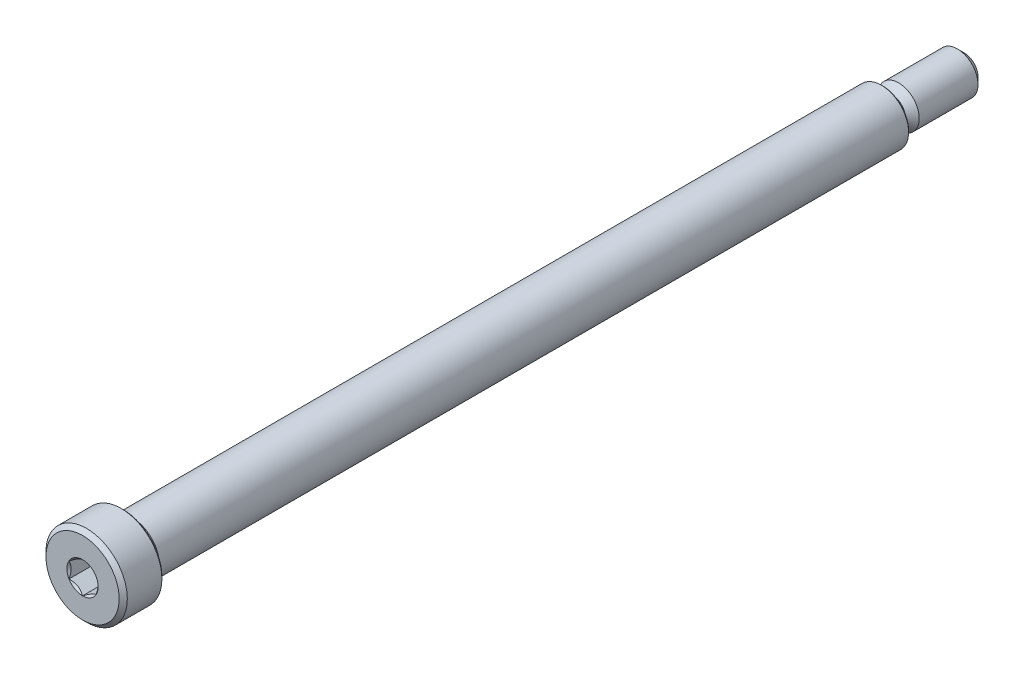
ISO-10303-21;
HEADER;
FILE_DESCRIPTION(('STEP AP214'),'2;1');
FILE_NAME('part.step','',(''),(''),'','','');
FILE_SCHEMA(('AUTOMOTIVE_DESIGN { 1 0 10303 214 1 1 1 1 }'));
ENDSEC;
DATA;
#1=APPLICATION_CONTEXT('core data for automotive mechanical design processes');
#2=APPLICATION_PROTOCOL_DEFINITION('international standard','automotive_design',2000,#1);
#3=PRODUCT_CONTEXT('',#1,'mechanical');
#4=PRODUCT('Part','Part','',(#3));
#5=PRODUCT_RELATED_PRODUCT_CATEGORY('part','',(#4));
#6=PRODUCT_DEFINITION_FORMATION('','',#4);
#7=PRODUCT_DEFINITION_CONTEXT('part definition',#1,'design');
#8=PRODUCT_DEFINITION('design','',#6,#7);
#9=PRODUCT_DEFINITION_SHAPE('','',#8);
#10=(LENGTH_UNIT() NAMED_UNIT(*) SI_UNIT(.MILLI.,.METRE.));
#11=(NAMED_UNIT(*) PLANE_ANGLE_UNIT() SI_UNIT($,.RADIAN.));
#12=(NAMED_UNIT(*) SI_UNIT($,.STERADIAN.) SOLID_ANGLE_UNIT());
#13=UNCERTAINTY_MEASURE_WITH_UNIT(LENGTH_MEASURE(1.E-05),#10,'distance_accuracy_value','');
#14=(GEOMETRIC_REPRESENTATION_CONTEXT(3) GLOBAL_UNCERTAINTY_ASSIGNED_CONTEXT((#13)) GLOBAL_UNIT_ASSIGNED_CONTEXT((#10,
#11,#12)) REPRESENTATION_CONTEXT('',''));
#15=CARTESIAN_POINT('',(0.,0.,0.));
#16=DIRECTION('',(0.,0.,1.));
#17=DIRECTION('',(1.,0.,0.));
#18=AXIS2_PLACEMENT_3D('',#15,#16,#17);
#19=CARTESIAN_POINT('',(0.,1.61924999999999,-51.59375));
#20=DIRECTION('',(0.,0.,1.));
#21=DIRECTION('',(1.,0.,0.));
#22=AXIS2_PLACEMENT_3D('',#19,#20,#21);
#23=PLANE('',#22);
#24=CARTESIAN_POINT('',(0.,0.,-51.59375));
#25=DIRECTION('',(0.,0.,1.));
#26=DIRECTION('',(1.,0.,0.));
#27=AXIS2_PLACEMENT_3D('',#24,#25,#26);
#28=CIRCLE('',#27,1.61924999999998);
#29=CARTESIAN_POINT('',(1.61924999999998,0.,-51.59375));
#30=VERTEX_POINT('',#29);
#31=EDGE_CURVE('E57',#30,#30,#28,.T.);
#32=ORIENTED_EDGE('',*,*,#31,.F.);
#33=EDGE_LOOP('',(#32));
#34=FACE_BOUND('',#33,.T.);
#35=ADVANCED_FACE('F43',(#34),#23,.F.);
#36=CARTESIAN_POINT('',(0.,0.,-51.59375));
#37=DIRECTION('',(0.,0.,1.));
#38=DIRECTION('',(1.,0.,0.));
#39=AXIS2_PLACEMENT_3D('',#36,#37,#38);
#40=CONICAL_SURFACE('',#39,1.61924999999998,0.785398163397446);
#41=CARTESIAN_POINT('',(0.,0.,-50.8));
#42=DIRECTION('',(0.,0.,1.));
#43=DIRECTION('',(1.,0.,0.));
#44=AXIS2_PLACEMENT_3D('',#41,#42,#43);
#45=CIRCLE('',#44,2.41299999999999);
#46=CARTESIAN_POINT('',(2.41299999999999,0.,-50.8));
#47=VERTEX_POINT('',#46);
#48=EDGE_CURVE('E225',#47,#47,#45,.T.);
#49=ORIENTED_EDGE('',*,*,#48,.F.);
#50=EDGE_LOOP('',(#49));
#51=FACE_BOUND('',#50,.T.);
#52=ORIENTED_EDGE('',*,*,#31,.T.);
#53=EDGE_LOOP('',(#52));
#54=FACE_BOUND('',#53,.T.);
#55=ADVANCED_FACE('F214',(#51,#54),#40,.T.);
#56=CARTESIAN_POINT('',(0.,0.,51.59375));
#57=DIRECTION('',(0.,0.,1.));
#58=DIRECTION('',(1.,0.,0.));
#59=AXIS2_PLACEMENT_3D('',#56,#57,#58);
#60=CYLINDRICAL_SURFACE('',#59,2.41299999999999);
#61=CARTESIAN_POINT('',(0.,0.,-43.9208333333333));
#62=DIRECTION('',(0.,0.,1.));
#63=DIRECTION('',(1.,0.,0.));
#64=AXIS2_PLACEMENT_3D('',#61,#62,#63);
#65=CIRCLE('',#64,2.41299999999999);
#66=CARTESIAN_POINT('',(2.41299999999999,0.,-43.9208333333333));
#67=VERTEX_POINT('',#66);
#68=EDGE_CURVE('E228',#67,#67,#65,.T.);
#69=ORIENTED_EDGE('',*,*,#68,.F.);
#70=EDGE_LOOP('',(#69));
#71=FACE_BOUND('',#70,.T.);
#72=ORIENTED_EDGE('',*,*,#48,.T.);
#73=EDGE_LOOP('',(#72));
#74=FACE_BOUND('',#73,.T.);
#75=ADVANCED_FACE('F219',(#71,#74),#60,.T.);
#76=CARTESIAN_POINT('',(0.,0.,-43.9208333333333));
#77=DIRECTION('',(0.,0.,-1.));
#78=DIRECTION('',(-1.,0.,0.));
#79=AXIS2_PLACEMENT_3D('',#76,#77,#78);
#80=CONICAL_SURFACE('',#79,2.41299999999999,0.785398163397448);
#81=CARTESIAN_POINT('',(0.,0.,-43.1270833333333));
#82=DIRECTION('',(0.,0.,1.));
#83=DIRECTION('',(1.,0.,0.));
#84=AXIS2_PLACEMENT_3D('',#81,#82,#83);
#85=CIRCLE('',#84,1.61924999999998);
#86=CARTESIAN_POINT('',(1.61924999999998,0.,-43.1270833333333));
#87=VERTEX_POINT('',#86);
#88=EDGE_CURVE('E234',#87,#87,#85,.T.);
#89=ORIENTED_EDGE('',*,*,#88,.F.);
#90=EDGE_LOOP('',(#89));
#91=FACE_BOUND('',#90,.T.);
#92=ORIENTED_EDGE('',*,*,#68,.T.);
#93=EDGE_LOOP('',(#92));
#94=FACE_BOUND('',#93,.T.);
#95=ADVANCED_FACE('F392',(#91,#94),#80,.T.);
#96=CARTESIAN_POINT('',(0.,0.,51.59375));
#97=DIRECTION('',(0.,0.,1.));
#98=DIRECTION('',(1.,0.,0.));
#99=AXIS2_PLACEMENT_3D('',#96,#97,#98);
#100=CYLINDRICAL_SURFACE('',#99,1.61924999999998);
#101=CARTESIAN_POINT('',(0.,0.,-42.465625));
#102=DIRECTION('',(0.,0.,1.));
#103=DIRECTION('',(1.,0.,0.));
#104=AXIS2_PLACEMENT_3D('',#101,#102,#103);
#105=CIRCLE('',#104,1.61924999999998);
#106=CARTESIAN_POINT('',(1.61924999999998,0.,-42.465625));
#107=VERTEX_POINT('',#106);
#108=EDGE_CURVE('E238',#107,#107,#105,.T.);
#109=ORIENTED_EDGE('',*,*,#108,.F.);
#110=EDGE_LOOP('',(#109));
#111=FACE_BOUND('',#110,.T.);
#112=ORIENTED_EDGE('',*,*,#88,.T.);
#113=EDGE_LOOP('',(#112));
#114=FACE_BOUND('',#113,.T.);
#115=ADVANCED_FACE('F388',(#111,#114),#100,.T.);
#116=CARTESIAN_POINT('',(0.,0.,-42.465625));
#117=DIRECTION('',(0.,0.,1.));
#118=DIRECTION('',(1.,0.,0.));
#119=AXIS2_PLACEMENT_3D('',#116,#117,#118);
#120=TOROIDAL_SURFACE('',#119,2.01612499999999,0.396875000000007);
#121=CARTESIAN_POINT('',(0.,0.,-42.06875));
#122=DIRECTION('',(0.,0.,1.));
#123=DIRECTION('',(1.,0.,0.));
#124=AXIS2_PLACEMENT_3D('',#121,#122,#123);
#125=CIRCLE('',#124,2.01612499999999);
#126=CARTESIAN_POINT('',(2.01612499999999,0.,-42.06875));
#127=VERTEX_POINT('',#126);
#128=EDGE_CURVE('E242',#127,#127,#125,.T.);
#129=ORIENTED_EDGE('',*,*,#128,.F.);
#130=EDGE_LOOP('',(#129));
#131=FACE_BOUND('',#130,.T.);
#132=ORIENTED_EDGE('',*,*,#108,.T.);
#133=EDGE_LOOP('',(#132));
#134=FACE_BOUND('',#133,.T.);
#135=ADVANCED_FACE('F384',(#131,#134),#120,.F.);
#136=CARTESIAN_POINT('',(0.,3.01625,-42.06875));
#137=DIRECTION('',(0.,0.,1.));
#138=DIRECTION('',(1.,0.,0.));
#139=AXIS2_PLACEMENT_3D('',#136,#137,#138);
#140=PLANE('',#139);
#141=CARTESIAN_POINT('',(0.,0.,-42.06875));
#142=DIRECTION('',(0.,0.,1.));
#143=DIRECTION('',(1.,0.,0.));
#144=AXIS2_PLACEMENT_3D('',#141,#142,#143);
#145=CIRCLE('',#144,3.01624999999999);
#146=CARTESIAN_POINT('',(3.01624999999999,0.,-42.06875));
#147=VERTEX_POINT('',#146);
#148=EDGE_CURVE('E246',#147,#147,#145,.T.);
#149=ORIENTED_EDGE('',*,*,#148,.F.);
#150=EDGE_LOOP('',(#149));
#151=FACE_BOUND('',#150,.T.);
#152=ORIENTED_EDGE('',*,*,#128,.T.);
#153=EDGE_LOOP('',(#152));
#154=FACE_BOUND('',#153,.T.);
#155=ADVANCED_FACE('F380',(#151,#154),#140,.F.);
#156=CARTESIAN_POINT('',(0.,0.,-42.06875));
#157=DIRECTION('',(0.,0.,1.));
#158=DIRECTION('',(1.,0.,0.));
#159=AXIS2_PLACEMENT_3D('',#156,#157,#158);
#160=CONICAL_SURFACE('',#159,3.01624999999999,0.785398163397405);
#161=CARTESIAN_POINT('',(0.,0.,-41.91));
#162=DIRECTION('',(0.,0.,1.));
#163=DIRECTION('',(1.,0.,0.));
#164=AXIS2_PLACEMENT_3D('',#161,#162,#163);
#165=CIRCLE('',#164,3.17499999999999);
#166=CARTESIAN_POINT('',(3.17499999999999,0.,-41.91));
#167=VERTEX_POINT('',#166);
#168=EDGE_CURVE('E250',#167,#167,#165,.T.);
#169=ORIENTED_EDGE('',*,*,#168,.F.);
#170=EDGE_LOOP('',(#169));
#171=FACE_BOUND('',#170,.T.);
#172=ORIENTED_EDGE('',*,*,#148,.T.);
#173=EDGE_LOOP('',(#172));
#174=FACE_BOUND('',#173,.T.);
#175=ADVANCED_FACE('F376',(#171,#174),#160,.T.);
#176=CARTESIAN_POINT('',(0.,0.,51.59375));
#177=DIRECTION('',(0.,0.,1.));
#178=DIRECTION('',(1.,0.,0.));
#179=AXIS2_PLACEMENT_3D('',#176,#177,#178);
#180=CYLINDRICAL_SURFACE('',#179,3.17499999999999);
#181=CARTESIAN_POINT('',(0.,0.,45.7729166666666));
#182=DIRECTION('',(0.,0.,1.));
#183=DIRECTION('',(1.,0.,0.));
#184=AXIS2_PLACEMENT_3D('',#181,#182,#183);
#185=CIRCLE('',#184,3.17499999999999);
#186=CARTESIAN_POINT('',(3.17499999999999,0.,45.7729166666666));
#187=VERTEX_POINT('',#186);
#188=EDGE_CURVE('E254',#187,#187,#185,.T.);
#189=ORIENTED_EDGE('',*,*,#188,.F.);
#190=EDGE_LOOP('',(#189));
#191=FACE_BOUND('',#190,.T.);
#192=ORIENTED_EDGE('',*,*,#168,.T.);
#193=EDGE_LOOP('',(#192));
#194=FACE_BOUND('',#193,.T.);
#195=ADVANCED_FACE('F372',(#191,#194),#180,.T.);
#196=CARTESIAN_POINT('',(0.,0.,45.7729166666666));
#197=DIRECTION('',(0.,0.,-1.));
#198=DIRECTION('',(-1.,0.,0.));
#199=AXIS2_PLACEMENT_3D('',#196,#197,#198);
#200=CONICAL_SURFACE('',#199,3.17499999999999,0.785398163397451);
#201=CARTESIAN_POINT('',(0.,0.,45.9316666666667));
#202=DIRECTION('',(0.,0.,1.));
#203=DIRECTION('',(1.,0.,0.));
#204=AXIS2_PLACEMENT_3D('',#201,#202,#203);
#205=CIRCLE('',#204,3.01624999999999);
#206=CARTESIAN_POINT('',(3.01624999999999,0.,45.9316666666667));
#207=VERTEX_POINT('',#206);
#208=EDGE_CURVE('E258',#207,#207,#205,.T.);
#209=ORIENTED_EDGE('',*,*,#208,.F.);
#210=EDGE_LOOP('',(#209));
#211=FACE_BOUND('',#210,.T.);
#212=ORIENTED_EDGE('',*,*,#188,.T.);
#213=EDGE_LOOP('',(#212));
#214=FACE_BOUND('',#213,.T.);
#215=ADVANCED_FACE('F368',(#211,#214),#200,.T.);
#216=CARTESIAN_POINT('',(0.,0.,51.59375));
#217=DIRECTION('',(0.,0.,1.));
#218=DIRECTION('',(1.,0.,0.));
#219=AXIS2_PLACEMENT_3D('',#216,#217,#218);
#220=CYLINDRICAL_SURFACE('',#219,3.01624999999999);
#221=CARTESIAN_POINT('',(0.,0.,46.7121875));
#222=DIRECTION('',(0.,0.,1.));
#223=DIRECTION('',(1.,0.,0.));
#224=AXIS2_PLACEMENT_3D('',#221,#222,#223);
#225=CIRCLE('',#224,3.01624999999999);
#226=CARTESIAN_POINT('',(3.01624999999999,0.,46.7121875));
#227=VERTEX_POINT('',#226);
#228=EDGE_CURVE('E262',#227,#227,#225,.T.);
#229=ORIENTED_EDGE('',*,*,#228,.F.);
#230=EDGE_LOOP('',(#229));
#231=FACE_BOUND('',#230,.T.);
#232=ORIENTED_EDGE('',*,*,#208,.T.);
#233=EDGE_LOOP('',(#232));
#234=FACE_BOUND('',#233,.T.);
#235=ADVANCED_FACE('F364',(#231,#234),#220,.T.);
#236=CARTESIAN_POINT('',(0.,0.,46.7121875));
#237=DIRECTION('',(0.,0.,1.));
#238=DIRECTION('',(1.,0.,0.));
#239=AXIS2_PLACEMENT_3D('',#236,#237,#238);
#240=TOROIDAL_SURFACE('',#239,3.13531249999999,0.119062500000002);
#241=CARTESIAN_POINT('',(0.,0.,46.83125));
#242=DIRECTION('',(0.,0.,1.));
#243=DIRECTION('',(1.,0.,0.));
#244=AXIS2_PLACEMENT_3D('',#241,#242,#243);
#245=CIRCLE('',#244,3.13531249999999);
#246=CARTESIAN_POINT('',(3.13531249999999,0.,46.83125));
#247=VERTEX_POINT('',#246);
#248=EDGE_CURVE('E266',#247,#247,#245,.T.);
#249=ORIENTED_EDGE('',*,*,#248,.F.);
#250=EDGE_LOOP('',(#249));
#251=FACE_BOUND('',#250,.T.);
#252=ORIENTED_EDGE('',*,*,#228,.T.);
#253=EDGE_LOOP('',(#252));
#254=FACE_BOUND('',#253,.T.);
#255=ADVANCED_FACE('F360',(#251,#254),#240,.F.);
#256=CARTESIAN_POINT('',(0.,4.524375,46.83125));
#257=DIRECTION('',(0.,0.,1.));
#258=DIRECTION('',(1.,0.,0.));
#259=AXIS2_PLACEMENT_3D('',#256,#257,#258);
#260=PLANE('',#259);
#261=CARTESIAN_POINT('',(0.,0.,46.83125));
#262=DIRECTION('',(0.,0.,1.));
#263=DIRECTION('',(1.,0.,0.));
#264=AXIS2_PLACEMENT_3D('',#261,#262,#263);
#265=CIRCLE('',#264,4.52437499999999);
#266=CARTESIAN_POINT('',(4.52437499999999,0.,46.83125));
#267=VERTEX_POINT('',#266);
#268=EDGE_CURVE('E270',#267,#267,#265,.T.);
#269=ORIENTED_EDGE('',*,*,#268,.F.);
#270=EDGE_LOOP('',(#269));
#271=FACE_BOUND('',#270,.T.);
#272=ORIENTED_EDGE('',*,*,#248,.T.);
#273=EDGE_LOOP('',(#272));
#274=FACE_BOUND('',#273,.T.);
#275=ADVANCED_FACE('F356',(#271,#274),#260,.F.);
#276=CARTESIAN_POINT('',(0.,0.,46.83125));
#277=DIRECTION('',(0.,0.,1.));
#278=DIRECTION('',(1.,0.,0.));
#279=AXIS2_PLACEMENT_3D('',#276,#277,#278);
#280=CONICAL_SURFACE('',#279,4.52437499999999,0.785398163397465);
#281=CARTESIAN_POINT('',(0.,0.,47.069375));
#282=DIRECTION('',(0.,0.,1.));
#283=DIRECTION('',(1.,0.,0.));
#284=AXIS2_PLACEMENT_3D('',#281,#282,#283);
#285=CIRCLE('',#284,4.76249999999999);
#286=CARTESIAN_POINT('',(4.76249999999999,0.,47.069375));
#287=VERTEX_POINT('',#286);
#288=EDGE_CURVE('E274',#287,#287,#285,.T.);
#289=ORIENTED_EDGE('',*,*,#288,.F.);
#290=EDGE_LOOP('',(#289));
#291=FACE_BOUND('',#290,.T.);
#292=ORIENTED_EDGE('',*,*,#268,.T.);
#293=EDGE_LOOP('',(#292));
#294=FACE_BOUND('',#293,.T.);
#295=ADVANCED_FACE('F352',(#291,#294),#280,.T.);
#296=CARTESIAN_POINT('',(0.,0.,51.59375));
#297=DIRECTION('',(0.,0.,1.));
#298=DIRECTION('',(1.,0.,0.));
#299=AXIS2_PLACEMENT_3D('',#296,#297,#298);
#300=CYLINDRICAL_SURFACE('',#299,4.76249999999999);
#301=CARTESIAN_POINT('',(0.,0.,51.1175));
#302=DIRECTION('',(0.,0.,1.));
#303=DIRECTION('',(1.,0.,0.));
#304=AXIS2_PLACEMENT_3D('',#301,#302,#303);
#305=CIRCLE('',#304,4.76249999999999);
#306=CARTESIAN_POINT('',(4.76249999999999,0.,51.1175));
#307=VERTEX_POINT('',#306);
#308=EDGE_CURVE('E278',#307,#307,#305,.T.);
#309=ORIENTED_EDGE('',*,*,#308,.F.);
#310=EDGE_LOOP('',(#309));
#311=FACE_BOUND('',#310,.T.);
#312=ORIENTED_EDGE('',*,*,#288,.T.);
#313=EDGE_LOOP('',(#312));
#314=FACE_BOUND('',#313,.T.);
#315=ADVANCED_FACE('F345',(#311,#314),#300,.T.);
#316=CARTESIAN_POINT('',(0.,0.,51.1175));
#317=DIRECTION('',(0.,0.,-1.));
#318=DIRECTION('',(-1.,0.,0.));
#319=AXIS2_PLACEMENT_3D('',#316,#317,#318);
#320=CONICAL_SURFACE('',#319,4.76249999999999,0.785398163397444);
#321=CARTESIAN_POINT('',(0.,0.,51.59375));
#322=DIRECTION('',(0.,0.,1.));
#323=DIRECTION('',(1.,0.,0.));
#324=AXIS2_PLACEMENT_3D('',#321,#322,#323);
#325=CIRCLE('',#324,4.28624999999999);
#326=CARTESIAN_POINT('',(4.28624999999999,0.,51.59375));
#327=VERTEX_POINT('',#326);
#328=EDGE_CURVE('E282',#327,#327,#325,.T.);
#329=ORIENTED_EDGE('',*,*,#328,.F.);
#330=EDGE_LOOP('',(#329));
#331=FACE_BOUND('',#330,.T.);
#332=ORIENTED_EDGE('',*,*,#308,.T.);
#333=EDGE_LOOP('',(#332));
#334=FACE_BOUND('',#333,.T.);
#335=ADVANCED_FACE('F340',(#331,#334),#320,.T.);
#336=CARTESIAN_POINT('',(0.,0.,51.59375));
#337=DIRECTION('',(0.,0.,-1.));
#338=DIRECTION('',(-1.,0.,0.));
#339=AXIS2_PLACEMENT_3D('',#336,#337,#338);
#340=PLANE('',#339);
#341=CARTESIAN_POINT('',(0.,0.,51.59375));
#342=DIRECTION('',(0.,0.,1.));
#343=DIRECTION('',(1.,0.,0.));
#344=AXIS2_PLACEMENT_3D('',#341,#342,#343);
#345=CIRCLE('',#344,1.83308710467706);
#346=CARTESIAN_POINT('',(-1.5875,0.916543552338531,51.59375));
#347=VERTEX_POINT('',#346);
#348=CARTESIAN_POINT('',(-1.5875,-0.916543552338529,51.59375));
#349=VERTEX_POINT('',#348);
#350=EDGE_CURVE('E103',#347,#349,#345,.T.);
#351=ORIENTED_EDGE('',*,*,#350,.F.);
#352=CARTESIAN_POINT('',(0.,1.83308710467706,51.59375));
#353=VERTEX_POINT('',#352);
#354=EDGE_CURVE('E113',#353,#347,#345,.T.);
#355=ORIENTED_EDGE('',*,*,#354,.F.);
#356=CARTESIAN_POINT('',(1.5875,0.916543552338537,51.59375));
#357=VERTEX_POINT('',#356);
#358=EDGE_CURVE('E63',#357,#353,#345,.T.);
#359=ORIENTED_EDGE('',*,*,#358,.F.);
#360=CARTESIAN_POINT('',(1.5875,-0.916543552338529,51.59375));
#361=VERTEX_POINT('',#360);
#362=EDGE_CURVE('E70',#361,#357,#345,.T.);
#363=ORIENTED_EDGE('',*,*,#362,.F.);
#364=CARTESIAN_POINT('',(0.,-1.83308710467706,51.59375));
#365=VERTEX_POINT('',#364);
#366=EDGE_CURVE('E144',#365,#361,#345,.T.);
#367=ORIENTED_EDGE('',*,*,#366,.F.);
#368=EDGE_CURVE('E114',#349,#365,#345,.T.);
#369=ORIENTED_EDGE('',*,*,#368,.F.);
#370=EDGE_LOOP('',(#351,#355,#359,#363,#367,#369));
#371=FACE_BOUND('',#370,.T.);
#372=ORIENTED_EDGE('',*,*,#328,.T.);
#373=EDGE_LOOP('',(#372));
#374=FACE_BOUND('',#373,.T.);
#375=ADVANCED_FACE('F142',(#371,#374),#340,.F.);
#376=CARTESIAN_POINT('',(0.,0.,51.59375));
#377=DIRECTION('',(0.,0.,1.));
#378=DIRECTION('',(1.,0.,0.));
#379=AXIS2_PLACEMENT_3D('',#376,#377,#378);
#380=CONICAL_SURFACE('',#379,1.83308710467706,0.78539816339745);
#381=ORIENTED_EDGE('',*,*,#368,.T.);
#382=CARTESIAN_POINT('',(-1.5877,-0.916428082284692,51.5938654809637));
#383=CARTESIAN_POINT('',(-1.53312479190087,-0.947937093371808,51.5623808083706));
#384=CARTESIAN_POINT('',(-1.47763696320971,-0.979973006203393,51.5327450460135));
#385=CARTESIAN_POINT('',(-1.36449087915364,-1.04529792829092,51.4784822600208));
#386=CARTESIAN_POINT('',(-1.30682185887062,-1.07859315267522,51.4538854351332));
#387=CARTESIAN_POINT('',(-1.1905349781269,-1.14573141457583,51.4117503642726));
#388=CARTESIAN_POINT('',(-1.13194674474407,-1.17955734689075,51.3941061927298));
#389=CARTESIAN_POINT('',(-1.01348022674557,-1.24795402294714,51.366921470085));
#390=CARTESIAN_POINT('',(-0.953605562983896,-1.28252267618758,51.3573606206951));
#391=CARTESIAN_POINT('',(-0.850418771876558,-1.34209759781022,51.348734413104));
#392=CARTESIAN_POINT('',(-0.807240015952288,-1.36702686416637,51.3474571928096));
#393=CARTESIAN_POINT('',(-0.720953038535398,-1.41684467380557,51.3496070558147));
#394=CARTESIAN_POINT('',(-0.677844847078611,-1.44173319974743,51.3530357885493));
#395=CARTESIAN_POINT('',(-0.59204633500203,-1.49126899379091,51.3644009944333));
#396=CARTESIAN_POINT('',(-0.549356408925406,-1.51591603410293,51.3723413718016));
#397=CARTESIAN_POINT('',(-0.464693063478358,-1.56479643938728,51.3922984144511));
#398=CARTESIAN_POINT('',(-0.422719959755075,-1.58902962212064,51.4043168292087));
#399=CARTESIAN_POINT('',(-0.315211458113566,-1.65109968448354,51.4399968972472));
#400=CARTESIAN_POINT('',(-0.2503427717089,-1.68855163804125,51.4663485723031));
#401=CARTESIAN_POINT('',(-0.154961599380923,-1.74361998356043,51.5108335368517));
#402=CARTESIAN_POINT('',(-0.123530699536155,-1.76176662204668,51.5264628578011));
#403=CARTESIAN_POINT('',(-0.0612469855696353,-1.79772614107138,51.5591484878611));
#404=CARTESIAN_POINT('',(-0.0303939039605752,-1.8155391760437,51.576204115657));
#405=CARTESIAN_POINT('',(0.000200000000000565,-1.8332025747309,51.5938654809637));
#406=B_SPLINE_CURVE_WITH_KNOTS('',3,(#382,#383,#384,#385,#386,#387,#388,#389,#390,#391,#392,
#393,#394,#395,#396,#397,#398,#399,#400,#401,#402,#403,#404,#405),.UNSPECIFIED.,.F.,.F.,(4,2,2,
2,2,2,2,2,2,2,2,4),(0.,0.211482650810815,0.424197870807276,0.633533884524816,0.84234265326335,
0.991755553727144,1.14122083674205,1.29081565918878,1.44047473906438,1.6781878086972,
1.79671410024895,1.91518409436632),.UNSPECIFIED.);
#407=EDGE_CURVE('E11',#349,#365,#406,.T.);
#408=ORIENTED_EDGE('',*,*,#407,.F.);
#409=EDGE_LOOP('',(#381,#408));
#410=FACE_BOUND('',#409,.T.);
#411=ADVANCED_FACE('F118',(#410),#380,.F.);
#412=ORIENTED_EDGE('',*,*,#366,.T.);
#413=CARTESIAN_POINT('',(-0.000200000000001966,-1.8332025747309,51.5938654809637));
#414=CARTESIAN_POINT('',(0.0543752080991335,-1.80169356364378,51.5623808083706));
#415=CARTESIAN_POINT('',(0.109863036790287,-1.7696576508122,51.5327450460135));
#416=CARTESIAN_POINT('',(0.223009120846356,-1.70433272872468,51.4784822600208));
#417=CARTESIAN_POINT('',(0.28067814112938,-1.67103750434037,51.4538854351332));
#418=CARTESIAN_POINT('',(0.396965021873103,-1.60389924243976,51.4117503642726));
#419=CARTESIAN_POINT('',(0.455553255255931,-1.57007331012484,51.3941061927298));
#420=CARTESIAN_POINT('',(0.574019773254431,-1.50167663406845,51.366921470085));
#421=CARTESIAN_POINT('',(0.633894437016106,-1.46710798082801,51.3573606206951));
#422=CARTESIAN_POINT('',(0.737081228123444,-1.40753305920537,51.348734413104));
#423=CARTESIAN_POINT('',(0.780259984047714,-1.38260379284922,51.3474571928096));
#424=CARTESIAN_POINT('',(0.866546961464604,-1.33278598321002,51.3496070558147));
#425=CARTESIAN_POINT('',(0.90965515292139,-1.30789745726817,51.3530357885493));
#426=CARTESIAN_POINT('',(0.995453664997972,-1.25836166322468,51.3644009944333));
#427=CARTESIAN_POINT('',(1.0381435910746,-1.23371462291266,51.3723413718016));
#428=CARTESIAN_POINT('',(1.12280693652164,-1.18483421762831,51.3922984144511));
#429=CARTESIAN_POINT('',(1.16478004024493,-1.16060103489495,51.4043168292087));
#430=CARTESIAN_POINT('',(1.27228854188644,-1.09853097253205,51.4399968972472));
#431=CARTESIAN_POINT('',(1.3371572282911,-1.06107901897434,51.4663485723031));
#432=CARTESIAN_POINT('',(1.43253840061908,-1.00601067345516,51.5108335368517));
#433=CARTESIAN_POINT('',(1.46396930046384,-0.987864034968915,51.5264628578011));
#434=CARTESIAN_POINT('',(1.52625301443036,-0.951904515944215,51.5591484878611));
#435=CARTESIAN_POINT('',(1.55710609603942,-0.934091480971895,51.576204115657));
#436=CARTESIAN_POINT('',(1.5877,-0.916428082284694,51.5938654809637));
#437=B_SPLINE_CURVE_WITH_KNOTS('',3,(#413,#414,#415,#416,#417,#418,#419,#420,#421,#422,#423,
#424,#425,#426,#427,#428,#429,#430,#431,#432,#433,#434,#435,#436),.UNSPECIFIED.,.F.,.F.,(4,2,2,
2,2,2,2,2,2,2,2,4),(0.,0.211482650810815,0.424197870807278,0.633533884524818,0.842342653263353,
0.991755553727146,1.14122083674205,1.29081565918878,1.44047473906438,1.6781878086972,
1.79671410024894,1.91518409436631),.UNSPECIFIED.);
#438=EDGE_CURVE('E149',#365,#361,#437,.T.);
#439=ORIENTED_EDGE('',*,*,#438,.F.);
#440=EDGE_LOOP('',(#412,#439));
#441=FACE_BOUND('',#440,.T.);
#442=ADVANCED_FACE('F330',(#441),#380,.F.);
#443=ORIENTED_EDGE('',*,*,#362,.T.);
#444=CARTESIAN_POINT('',(1.5875,-1.82796193752854,52.181737263254));
#445=CARTESIAN_POINT('',(1.5875,-1.78345227640908,52.1481366526755));
#446=CARTESIAN_POINT('',(1.5875,-1.73869460884114,52.1148654952982));
#447=CARTESIAN_POINT('',(1.5875,-1.64858256619968,52.0491181178338));
#448=CARTESIAN_POINT('',(1.5875,-1.60322804415397,52.0166420993982));
#449=CARTESIAN_POINT('',(1.5875,-1.46545441997287,51.9201476121245));
#450=CARTESIAN_POINT('',(1.5875,-1.37200191361453,51.8575801635837));
#451=CARTESIAN_POINT('',(1.5875,-1.17603565005265,51.734752804527));
#452=CARTESIAN_POINT('',(1.5875,-1.0733091548238,51.674828449735));
#453=CARTESIAN_POINT('',(1.5875,-0.862725191180891,51.5652140327188));
#454=CARTESIAN_POINT('',(1.5875,-0.754886591703735,51.5154894689971));
#455=CARTESIAN_POINT('',(1.5875,-0.593019911876898,51.4546560741112));
#456=CARTESIAN_POINT('',(1.5875,-0.54138828202183,51.4371964520654));
#457=CARTESIAN_POINT('',(1.5875,-0.436878539726306,51.4064223678696));
#458=CARTESIAN_POINT('',(1.5875,-0.384000341684466,51.3931081912829));
#459=CARTESIAN_POINT('',(1.5875,-0.278196924280279,51.3715383054896));
#460=CARTESIAN_POINT('',(1.5875,-0.225289653887532,51.3631959280048));
#461=CARTESIAN_POINT('',(1.5875,-0.118909299564334,51.3517325177097));
#462=CARTESIAN_POINT('',(1.5875,-0.0654363144870853,51.3486105873603));
#463=CARTESIAN_POINT('',(1.5875,0.0396125416393617,51.3478196410889));
#464=CARTESIAN_POINT('',(1.5875,0.0911870234776875,51.3499573430076));
#465=CARTESIAN_POINT('',(1.5875,0.193894008986133,51.359141368464));
#466=CARTESIAN_POINT('',(1.5875,0.245026469231597,51.366188168851));
#467=CARTESIAN_POINT('',(1.5875,0.347344844708745,51.3849252166609));
#468=CARTESIAN_POINT('',(1.5875,0.398516068757363,51.3966944835388));
#469=CARTESIAN_POINT('',(1.5875,0.499740445944844,51.424250946481));
#470=CARTESIAN_POINT('',(1.5875,0.549793692255949,51.4400378063498));
#471=CARTESIAN_POINT('',(1.5875,0.707380773963354,51.4956797782163));
#472=CARTESIAN_POINT('',(1.5875,0.812671633972065,51.5418718624579));
#473=CARTESIAN_POINT('',(1.5875,1.01830702525798,51.6445743357707));
#474=CARTESIAN_POINT('',(1.5875,1.11863208590429,51.7011217953494));
#475=CARTESIAN_POINT('',(1.5875,1.31036772781772,51.8177841931103));
#476=CARTESIAN_POINT('',(1.5875,1.40197355431623,51.8775822157844));
#477=CARTESIAN_POINT('',(1.5875,1.53693633902,51.9700238021751));
#478=CARTESIAN_POINT('',(1.5875,1.58134147295664,52.001163627594));
#479=CARTESIAN_POINT('',(1.5875,1.66954488801523,52.0642668194013));
#480=CARTESIAN_POINT('',(1.5875,1.71334333266279,52.0962299569622));
#481=CARTESIAN_POINT('',(1.5875,1.75688919183915,52.1285344886322));
#482=B_SPLINE_CURVE_WITH_KNOTS('',3,(#444,#445,#446,#447,#448,#449,#450,#451,#452,#453,#454,
#455,#456,#457,#458,#459,#460,#461,#462,#463,#464,#465,#466,#467,#468,#469,#470,#471,#472,#473,
#474,#475,#476,#477,#478,#479,#480,#481),.UNSPECIFIED.,.F.,.F.,(4,2,2,2,2,2,2,2,2,2,2,2,2,2,2,2,
2,2,4),(0.,0.1673008560385,0.334643709948953,0.671883358487458,1.0283722463923,1.38363464368218,
1.54700775551669,1.71039211899209,1.8708380735955,2.03125644026828,2.18586834465335,
2.34049526948591,2.49782525419329,2.65514207772673,2.99906299923215,3.34424006214766,
3.67226428551494,3.83496498281156,3.99762093763057),.UNSPECIFIED.);
#483=EDGE_CURVE('E158',#361,#357,#482,.T.);
#484=ORIENTED_EDGE('',*,*,#483,.F.);
#485=EDGE_LOOP('',(#443,#484));
#486=FACE_BOUND('',#485,.T.);
#487=ADVANCED_FACE('F327',(#486),#380,.F.);
#488=ORIENTED_EDGE('',*,*,#358,.T.);
#489=CARTESIAN_POINT('',(1.5877,0.916428082284694,51.5938654809637));
#490=CARTESIAN_POINT('',(1.53312479190086,0.94793709337181,51.5623808083706));
#491=CARTESIAN_POINT('',(1.47763696320971,0.979973006203395,51.5327450460135));
#492=CARTESIAN_POINT('',(1.36449087915364,1.04529792829092,51.4784822600208));
#493=CARTESIAN_POINT('',(1.30682185887062,1.07859315267522,51.4538854351332));
#494=CARTESIAN_POINT('',(1.1905349781269,1.14573141457583,51.4117503642726));
#495=CARTESIAN_POINT('',(1.13194674474407,1.17955734689075,51.3941061927298));
#496=CARTESIAN_POINT('',(1.01348022674557,1.24795402294714,51.366921470085));
#497=CARTESIAN_POINT('',(0.953605562983898,1.28252267618758,51.3573606206951));
#498=CARTESIAN_POINT('',(0.850418771876561,1.34209759781022,51.348734413104));
#499=CARTESIAN_POINT('',(0.807240015952291,1.36702686416637,51.3474571928096));
#500=CARTESIAN_POINT('',(0.720953038535402,1.41684467380557,51.3496070558147));
#501=CARTESIAN_POINT('',(0.677844847078616,1.44173319974742,51.3530357885493));
#502=CARTESIAN_POINT('',(0.592046335002035,1.49126899379091,51.3644009944333));
#503=CARTESIAN_POINT('',(0.549356408925411,1.51591603410293,51.3723413718016));
#504=CARTESIAN_POINT('',(0.464693063478364,1.56479643938728,51.3922984144511));
#505=CARTESIAN_POINT('',(0.422719959755079,1.58902962212064,51.4043168292087));
#506=CARTESIAN_POINT('',(0.31521145811357,1.65109968448354,51.4399968972472));
#507=CARTESIAN_POINT('',(0.250342771708904,1.68855163804125,51.4663485723031));
#508=CARTESIAN_POINT('',(0.154961599380927,1.74361998356043,51.5108335368517));
#509=CARTESIAN_POINT('',(0.123530699536159,1.76176662204668,51.5264628578011));
#510=CARTESIAN_POINT('',(0.061246985569638,1.79772614107138,51.5591484878611));
#511=CARTESIAN_POINT('',(0.0303939039605775,1.8155391760437,51.5762041156569));
#512=CARTESIAN_POINT('',(-0.000199999999999389,1.8332025747309,51.5938654809637));
#513=B_SPLINE_CURVE_WITH_KNOTS('',3,(#489,#490,#491,#492,#493,#494,#495,#496,#497,#498,#499,
#500,#501,#502,#503,#504,#505,#506,#507,#508,#509,#510,#511,#512),.UNSPECIFIED.,.F.,.F.,(4,2,2,
2,2,2,2,2,2,2,2,4),(0.,0.211482650810812,0.42419787080727,0.63353388452481,0.84234265326334,
0.991755553727133,1.14122083674204,1.29081565918876,1.44047473906437,1.67818780869719,
1.79671410024894,1.9151840943663),.UNSPECIFIED.);
#514=EDGE_CURVE('E178',#357,#353,#513,.T.);
#515=ORIENTED_EDGE('',*,*,#514,.F.);
#516=EDGE_LOOP('',(#488,#515));
#517=FACE_BOUND('',#516,.T.);
#518=ADVANCED_FACE('F336',(#517),#380,.F.);
#519=ORIENTED_EDGE('',*,*,#354,.T.);
#520=CARTESIAN_POINT('',(0.000200000000000722,1.8332025747309,51.5938654809637));
#521=CARTESIAN_POINT('',(-0.0543752080991344,1.80169356364378,51.5623808083706));
#522=CARTESIAN_POINT('',(-0.109863036790287,1.7696576508122,51.5327450460135));
#523=CARTESIAN_POINT('',(-0.223009120846357,1.70433272872468,51.4784822600208));
#524=CARTESIAN_POINT('',(-0.28067814112938,1.67103750434037,51.4538854351332));
#525=CARTESIAN_POINT('',(-0.396965021873102,1.60389924243976,51.4117503642726));
#526=CARTESIAN_POINT('',(-0.45555325525593,1.57007331012484,51.3941061927298));
#527=CARTESIAN_POINT('',(-0.574019773254429,1.50167663406845,51.366921470085));
#528=CARTESIAN_POINT('',(-0.633894437016104,1.46710798082801,51.3573606206951));
#529=CARTESIAN_POINT('',(-0.737081228123442,1.40753305920537,51.348734413104));
#530=CARTESIAN_POINT('',(-0.780259984047712,1.38260379284922,51.3474571928096));
#531=CARTESIAN_POINT('',(-0.866546961464601,1.33278598321002,51.3496070558147));
#532=CARTESIAN_POINT('',(-0.909655152921388,1.30789745726817,51.3530357885493));
#533=CARTESIAN_POINT('',(-0.99545366499797,1.25836166322469,51.3644009944333));
#534=CARTESIAN_POINT('',(-1.03814359107459,1.23371462291266,51.3723413718016));
#535=CARTESIAN_POINT('',(-1.12280693652164,1.18483421762831,51.3922984144511));
#536=CARTESIAN_POINT('',(-1.16478004024493,1.16060103489495,51.4043168292087));
#537=CARTESIAN_POINT('',(-1.27228854188643,1.09853097253205,51.4399968972472));
#538=CARTESIAN_POINT('',(-1.3371572282911,1.06107901897434,51.4663485723031));
#539=CARTESIAN_POINT('',(-1.43253840061908,1.00601067345516,51.5108335368517));
#540=CARTESIAN_POINT('',(-1.46396930046385,0.987864034968913,51.5264628578011));
#541=CARTESIAN_POINT('',(-1.52625301443037,0.951904515944213,51.5591484878611));
#542=CARTESIAN_POINT('',(-1.55710609603943,0.934091480971893,51.576204115657));
#543=CARTESIAN_POINT('',(-1.5877,0.916428082284693,51.5938654809637));
#544=B_SPLINE_CURVE_WITH_KNOTS('',3,(#520,#521,#522,#523,#524,#525,#526,#527,#528,#529,#530,
#531,#532,#533,#534,#535,#536,#537,#538,#539,#540,#541,#542,#543),.UNSPECIFIED.,.F.,.F.,(4,2,2,
2,2,2,2,2,2,2,2,4),(0.,0.211482650810815,0.424197870807276,0.633533884524816,0.842342653263349,
0.991755553727142,1.14122083674205,1.29081565918878,1.44047473906438,1.6781878086972,
1.79671410024894,1.91518409436631),.UNSPECIFIED.);
#545=EDGE_CURVE('E131',#353,#347,#544,.T.);
#546=ORIENTED_EDGE('',*,*,#545,.F.);
#547=EDGE_LOOP('',(#519,#546));
#548=FACE_BOUND('',#547,.T.);
#549=ADVANCED_FACE('F171',(#548),#380,.F.);
#550=ORIENTED_EDGE('',*,*,#350,.T.);
#551=CARTESIAN_POINT('',(-1.5875,-1.82796193726258,52.1817372630532));
#552=CARTESIAN_POINT('',(-1.5875,-1.78345227615059,52.1481366524824));
#553=CARTESIAN_POINT('',(-1.5875,-1.73869460859013,52.1148654951128));
#554=CARTESIAN_POINT('',(-1.5875,-1.64858256596372,52.0491181176639));
#555=CARTESIAN_POINT('',(-1.5875,-1.60322804392557,52.0166420992359));
#556=CARTESIAN_POINT('',(-1.5875,-1.46545441976761,51.9201476119854));
#557=CARTESIAN_POINT('',(-1.5875,-1.372001913425,51.85758016346));
#558=CARTESIAN_POINT('',(-1.5875,-1.17603564989744,51.734752804435));
#559=CARTESIAN_POINT('',(-1.5875,-1.07330915468727,51.6748284496591));
#560=CARTESIAN_POINT('',(-1.5875,-0.862725191083297,51.5652140326728));
#561=CARTESIAN_POINT('',(-1.5875,-0.754886591626392,51.5154894689649));
#562=CARTESIAN_POINT('',(-1.5875,-0.593019911814792,51.4546560740893));
#563=CARTESIAN_POINT('',(-1.5875,-0.541388281953344,51.4371964520431));
#564=CARTESIAN_POINT('',(-1.5875,-0.436878539644851,51.4064223678477));
#565=CARTESIAN_POINT('',(-1.5875,-0.384000341596421,51.393108191262));
#566=CARTESIAN_POINT('',(-1.5875,-0.278196924179274,51.371538305472));
#567=CARTESIAN_POINT('',(-1.5875,-0.225289653780159,51.3631959279895));
#568=CARTESIAN_POINT('',(-1.5875,-0.118909299444437,51.3517325177005));
#569=CARTESIAN_POINT('',(-1.5875,-0.0654363143610332,51.3486105873549));
#570=CARTESIAN_POINT('',(-1.5875,0.0396125417767706,51.3478196410921));
#571=CARTESIAN_POINT('',(-1.5875,0.0911870236203137,51.3499573430156));
#572=CARTESIAN_POINT('',(-1.5875,0.193894009138673,51.3591413684824));
#573=CARTESIAN_POINT('',(-1.5875,0.245026469388833,51.3661881688749));
#574=CARTESIAN_POINT('',(-1.5875,0.347344844875252,51.3849252166964));
#575=CARTESIAN_POINT('',(-1.5875,0.39851606892843,51.3966944835803));
#576=CARTESIAN_POINT('',(-1.5875,0.499740446124591,51.4242509465349));
#577=CARTESIAN_POINT('',(-1.5875,0.549793692439816,51.44003780641));
#578=CARTESIAN_POINT('',(-1.5875,0.707380774187262,51.4956797783058));
#579=CARTESIAN_POINT('',(-1.5875,0.812671634229888,51.5418718625745));
#580=CARTESIAN_POINT('',(-1.5875,1.01830702558102,51.6445743359444));
#581=CARTESIAN_POINT('',(-1.5875,1.11863208625862,51.7011217955531));
#582=CARTESIAN_POINT('',(-1.5875,1.31036772822831,51.8177841933715));
#583=CARTESIAN_POINT('',(-1.5875,1.40197355475199,51.8775822160727));
#584=CARTESIAN_POINT('',(-1.5875,1.53693633949296,51.9700238025041));
#585=CARTESIAN_POINT('',(-1.5875,1.58134147344183,52.0011636279364));
#586=CARTESIAN_POINT('',(-1.5875,1.66954488852479,52.0642668197706));
#587=CARTESIAN_POINT('',(-1.5875,1.7133433331845,52.0962299573449));
#588=CARTESIAN_POINT('',(-1.5875,1.75688919237298,52.1285344890283));
#589=B_SPLINE_CURVE_WITH_KNOTS('',3,(#551,#552,#553,#554,#555,#556,#557,#558,#559,#560,#561,
#562,#563,#564,#565,#566,#567,#568,#569,#570,#571,#572,#573,#574,#575,#576,#577,#578,#579,#580,
#581,#582,#583,#584,#585,#586,#587,#588),.UNSPECIFIED.,.F.,.F.,(4,2,2,2,2,2,2,2,2,2,2,2,2,2,2,2,
2,2,4),(0.,0.167300856006662,0.334643709885255,0.671883358358865,1.02837224619093,
1.38363464340873,1.54700775526169,1.7103921187555,1.87083807337658,2.03125644006703,
2.18586834446827,2.34049526931701,2.49782525404182,2.65514207759268,2.9990629992233,
3.34424006226482,3.67226428573993,3.83496498308973,3.99762093796191),.UNSPECIFIED.);
#590=EDGE_CURVE('E107',#347,#349,#589,.F.);
#591=ORIENTED_EDGE('',*,*,#590,.F.);
#592=EDGE_LOOP('',(#550,#591));
#593=FACE_BOUND('',#592,.T.);
#594=ADVANCED_FACE('F105',(#593),#380,.F.);
#595=CARTESIAN_POINT('',(0.,0.,48.498125));
#596=DIRECTION('',(0.,0.,1.));
#597=DIRECTION('',(1.,0.,0.));
#598=AXIS2_PLACEMENT_3D('',#595,#596,#597);
#599=PLANE('',#598);
#600=DIRECTION('',(0.,-1.,0.));
#601=VECTOR('',#600,1.);
#602=CARTESIAN_POINT('',(-1.5875,0.916543552338531,48.498125));
#603=LINE('',#602,#601);
#604=CARTESIAN_POINT('',(-1.5875,0.916543552338531,48.498125));
#605=VERTEX_POINT('',#604);
#606=CARTESIAN_POINT('',(-1.5875,-0.916543552338531,48.498125));
#607=VERTEX_POINT('',#606);
#608=EDGE_CURVE('E130',#605,#607,#603,.T.);
#609=ORIENTED_EDGE('',*,*,#608,.T.);
#610=DIRECTION('',(0.866025403784439,-0.5,0.));
#611=VECTOR('',#610,1.);
#612=CARTESIAN_POINT('',(-1.5875,-0.916543552338531,48.498125));
#613=LINE('',#612,#611);
#614=CARTESIAN_POINT('',(0.,-1.83308710467706,48.498125));
#615=VERTEX_POINT('',#614);
#616=EDGE_CURVE('E135',#607,#615,#613,.T.);
#617=ORIENTED_EDGE('',*,*,#616,.T.);
#618=DIRECTION('',(0.866025403784439,0.5,0.));
#619=VECTOR('',#618,1.);
#620=CARTESIAN_POINT('',(0.,-1.83308710467706,48.498125));
#621=LINE('',#620,#619);
#622=CARTESIAN_POINT('',(1.5875,-0.916543552338531,48.498125));
#623=VERTEX_POINT('',#622);
#624=EDGE_CURVE('E312',#615,#623,#621,.T.);
#625=ORIENTED_EDGE('',*,*,#624,.T.);
#626=DIRECTION('',(0.,1.,0.));
#627=VECTOR('',#626,1.);
#628=CARTESIAN_POINT('',(1.5875,-0.916543552338531,48.498125));
#629=LINE('',#628,#627);
#630=CARTESIAN_POINT('',(1.5875,0.916543552338531,48.498125));
#631=VERTEX_POINT('',#630);
#632=EDGE_CURVE('E308',#623,#631,#629,.T.);
#633=ORIENTED_EDGE('',*,*,#632,.T.);
#634=DIRECTION('',(-0.866025403784439,0.5,0.));
#635=VECTOR('',#634,1.);
#636=CARTESIAN_POINT('',(1.5875,0.916543552338531,48.498125));
#637=LINE('',#636,#635);
#638=CARTESIAN_POINT('',(0.,1.83308710467706,48.498125));
#639=VERTEX_POINT('',#638);
#640=EDGE_CURVE('E304',#631,#639,#637,.T.);
#641=ORIENTED_EDGE('',*,*,#640,.T.);
#642=DIRECTION('',(-0.866025403784439,-0.5,0.));
#643=VECTOR('',#642,1.);
#644=CARTESIAN_POINT('',(0.,1.83308710467706,48.498125));
#645=LINE('',#644,#643);
#646=EDGE_CURVE('E139',#639,#605,#645,.T.);
#647=ORIENTED_EDGE('',*,*,#646,.T.);
#648=EDGE_LOOP('',(#609,#617,#625,#633,#641,#647));
#649=FACE_BOUND('',#648,.T.);
#650=ADVANCED_FACE('F170',(#649),#599,.T.);
#651=CARTESIAN_POINT('',(-1.5875,-0.916543552338531,48.498125));
#652=DIRECTION('',(-0.5,-0.866025403784439,0.));
#653=DIRECTION('',(0.866025403784439,-0.5,0.));
#654=AXIS2_PLACEMENT_3D('',#651,#652,#653);
#655=PLANE('',#654);
#656=DIRECTION('',(0.,0.,1.));
#657=VECTOR('',#656,1.);
#658=CARTESIAN_POINT('',(-1.5875,-0.916543552338531,48.498125));
#659=LINE('',#658,#657);
#660=EDGE_CURVE('E125',#607,#349,#659,.T.);
#661=ORIENTED_EDGE('',*,*,#660,.T.);
#662=ORIENTED_EDGE('',*,*,#407,.T.);
#663=DIRECTION('',(0.,0.,1.));
#664=VECTOR('',#663,1.);
#665=CARTESIAN_POINT('',(0.,-1.83308710467706,48.498125));
#666=LINE('',#665,#664);
#667=EDGE_CURVE('E138',#615,#365,#666,.T.);
#668=ORIENTED_EDGE('',*,*,#667,.F.);
#669=ORIENTED_EDGE('',*,*,#616,.F.);
#670=EDGE_LOOP('',(#661,#662,#668,#669));
#671=FACE_BOUND('',#670,.T.);
#672=ADVANCED_FACE('F133',(#671),#655,.F.);
#673=CARTESIAN_POINT('',(0.,-1.83308710467706,48.498125));
#674=DIRECTION('',(0.5,-0.866025403784439,0.));
#675=DIRECTION('',(0.866025403784439,0.5,0.));
#676=AXIS2_PLACEMENT_3D('',#673,#674,#675);
#677=PLANE('',#676);
#678=ORIENTED_EDGE('',*,*,#667,.T.);
#679=ORIENTED_EDGE('',*,*,#438,.T.);
#680=DIRECTION('',(0.,0.,1.));
#681=VECTOR('',#680,1.);
#682=CARTESIAN_POINT('',(1.5875,-0.916543552338531,48.498125));
#683=LINE('',#682,#681);
#684=EDGE_CURVE('E288',#623,#361,#683,.T.);
#685=ORIENTED_EDGE('',*,*,#684,.F.);
#686=ORIENTED_EDGE('',*,*,#624,.F.);
#687=EDGE_LOOP('',(#678,#679,#685,#686));
#688=FACE_BOUND('',#687,.T.);
#689=ADVANCED_FACE('F165',(#688),#677,.F.);
#690=CARTESIAN_POINT('',(1.5875,-0.916543552338531,48.498125));
#691=DIRECTION('',(1.,0.,0.));
#692=DIRECTION('',(0.,1.,0.));
#693=AXIS2_PLACEMENT_3D('',#690,#691,#692);
#694=PLANE('',#693);
#695=ORIENTED_EDGE('',*,*,#684,.T.);
#696=ORIENTED_EDGE('',*,*,#483,.T.);
#697=DIRECTION('',(0.,0.,1.));
#698=VECTOR('',#697,1.);
#699=CARTESIAN_POINT('',(1.5875,0.916543552338531,48.498125));
#700=LINE('',#699,#698);
#701=EDGE_CURVE('E291',#631,#357,#700,.T.);
#702=ORIENTED_EDGE('',*,*,#701,.F.);
#703=ORIENTED_EDGE('',*,*,#632,.F.);
#704=EDGE_LOOP('',(#695,#696,#702,#703));
#705=FACE_BOUND('',#704,.T.);
#706=ADVANCED_FACE('F203',(#705),#694,.F.);
#707=CARTESIAN_POINT('',(1.5875,0.916543552338531,48.498125));
#708=DIRECTION('',(0.5,0.866025403784439,0.));
#709=DIRECTION('',(-0.866025403784439,0.5,0.));
#710=AXIS2_PLACEMENT_3D('',#707,#708,#709);
#711=PLANE('',#710);
#712=ORIENTED_EDGE('',*,*,#701,.T.);
#713=ORIENTED_EDGE('',*,*,#514,.T.);
#714=DIRECTION('',(0.,0.,1.));
#715=VECTOR('',#714,1.);
#716=CARTESIAN_POINT('',(0.,1.83308710467706,48.498125));
#717=LINE('',#716,#715);
#718=EDGE_CURVE('E295',#639,#353,#717,.T.);
#719=ORIENTED_EDGE('',*,*,#718,.F.);
#720=ORIENTED_EDGE('',*,*,#640,.F.);
#721=EDGE_LOOP('',(#712,#713,#719,#720));
#722=FACE_BOUND('',#721,.T.);
#723=ADVANCED_FACE('F199',(#722),#711,.F.);
#724=CARTESIAN_POINT('',(0.,1.83308710467706,48.498125));
#725=DIRECTION('',(-0.5,0.866025403784439,0.));
#726=DIRECTION('',(-0.866025403784439,-0.5,0.));
#727=AXIS2_PLACEMENT_3D('',#724,#725,#726);
#728=PLANE('',#727);
#729=ORIENTED_EDGE('',*,*,#718,.T.);
#730=ORIENTED_EDGE('',*,*,#545,.T.);
#731=DIRECTION('',(0.,0.,1.));
#732=VECTOR('',#731,1.);
#733=CARTESIAN_POINT('',(-1.5875,0.916543552338531,48.498125));
#734=LINE('',#733,#732);
#735=EDGE_CURVE('E127',#605,#347,#734,.T.);
#736=ORIENTED_EDGE('',*,*,#735,.F.);
#737=ORIENTED_EDGE('',*,*,#646,.F.);
#738=EDGE_LOOP('',(#729,#730,#736,#737));
#739=FACE_BOUND('',#738,.T.);
#740=ADVANCED_FACE('F196',(#739),#728,.F.);
#741=CARTESIAN_POINT('',(-1.5875,0.916543552338531,48.498125));
#742=DIRECTION('',(-1.,0.,0.));
#743=DIRECTION('',(0.,0.,1.));
#744=AXIS2_PLACEMENT_3D('',#741,#742,#743);
#745=PLANE('',#744);
#746=ORIENTED_EDGE('',*,*,#735,.T.);
#747=ORIENTED_EDGE('',*,*,#590,.T.);
#748=ORIENTED_EDGE('',*,*,#660,.F.);
#749=ORIENTED_EDGE('',*,*,#608,.F.);
#750=EDGE_LOOP('',(#746,#747,#748,#749));
#751=FACE_BOUND('',#750,.T.);
#752=ADVANCED_FACE('F123',(#751),#745,.F.);
#753=CLOSED_SHELL('',(#35,#55,#75,#95,#115,#135,#155,#175,#195,#215,#235,#255,#275,#295,#315,
#335,#375,#411,#442,#487,#518,#549,#594,#650,#672,#689,#706,#723,#740,#752));
#754=MANIFOLD_SOLID_BREP('B2',#753);
#755=ADVANCED_BREP_SHAPE_REPRESENTATION('',(#18,#754),#14);
#756=SHAPE_DEFINITION_REPRESENTATION(#9,#755);
ENDSEC;
END-ISO-10303-21;
